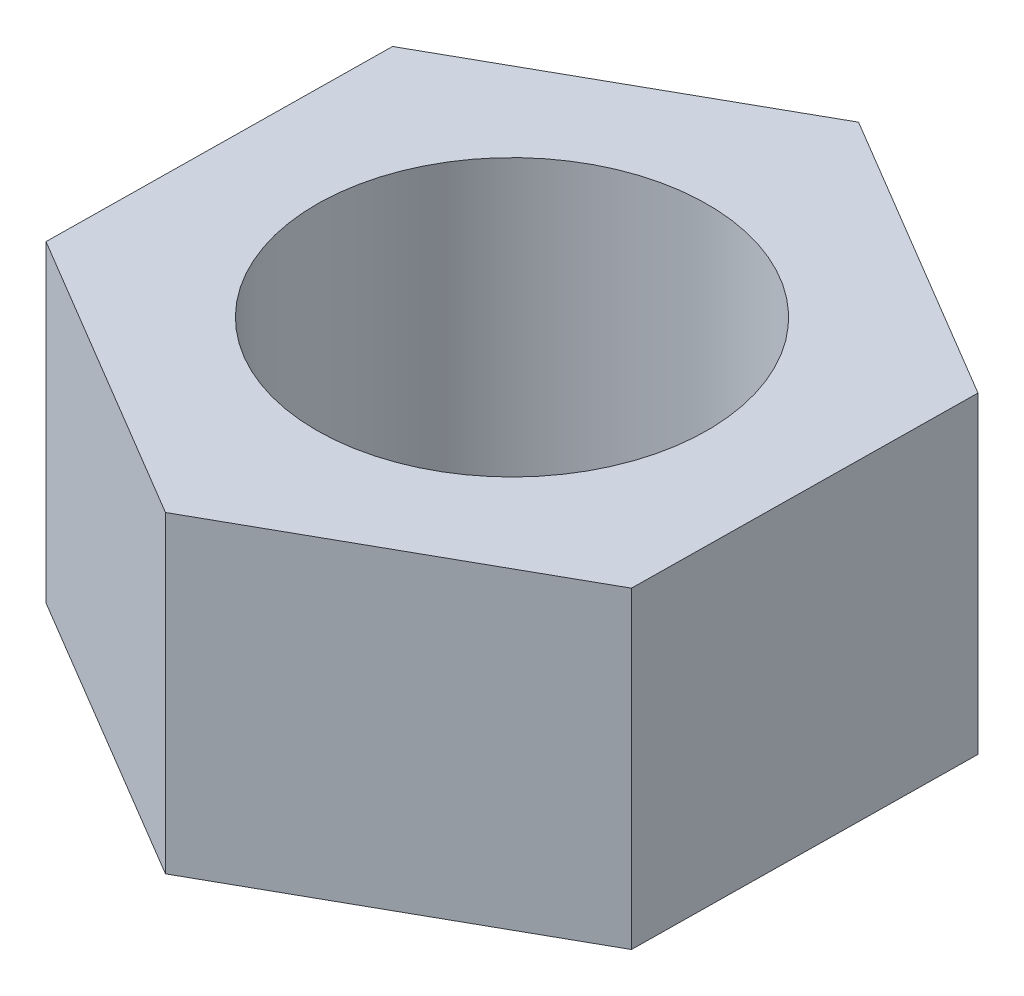
ISO-10303-21;
HEADER;
FILE_DESCRIPTION(('STEP AP214'),'2;1');
FILE_NAME('part.step','',(''),(''),'','','');
FILE_SCHEMA(('AUTOMOTIVE_DESIGN { 1 0 10303 214 1 1 1 1 }'));
ENDSEC;
DATA;
#1=APPLICATION_CONTEXT('core data for automotive mechanical design processes');
#2=APPLICATION_PROTOCOL_DEFINITION('international standard','automotive_design',2000,#1);
#3=PRODUCT_CONTEXT('',#1,'mechanical');
#4=PRODUCT('Part','Part','',(#3));
#5=PRODUCT_RELATED_PRODUCT_CATEGORY('part','',(#4));
#6=PRODUCT_DEFINITION_FORMATION('','',#4);
#7=PRODUCT_DEFINITION_CONTEXT('part definition',#1,'design');
#8=PRODUCT_DEFINITION('design','',#6,#7);
#9=PRODUCT_DEFINITION_SHAPE('','',#8);
#10=(LENGTH_UNIT() NAMED_UNIT(*) SI_UNIT(.MILLI.,.METRE.));
#11=(NAMED_UNIT(*) PLANE_ANGLE_UNIT() SI_UNIT($,.RADIAN.));
#12=(NAMED_UNIT(*) SI_UNIT($,.STERADIAN.) SOLID_ANGLE_UNIT());
#13=UNCERTAINTY_MEASURE_WITH_UNIT(LENGTH_MEASURE(1.E-05),#10,'distance_accuracy_value','');
#14=(GEOMETRIC_REPRESENTATION_CONTEXT(3) GLOBAL_UNCERTAINTY_ASSIGNED_CONTEXT((#13)) GLOBAL_UNIT_ASSIGNED_CONTEXT((#10,
#11,#12)) REPRESENTATION_CONTEXT('',''));
#15=CARTESIAN_POINT('',(0.,0.,0.));
#16=DIRECTION('',(0.,0.,1.));
#17=DIRECTION('',(1.,0.,0.));
#18=AXIS2_PLACEMENT_3D('',#15,#16,#17);
#19=CARTESIAN_POINT('',(0.,3.2,0.));
#20=DIRECTION('',(0.,1.,0.));
#21=DIRECTION('',(0.,0.,1.));
#22=AXIS2_PLACEMENT_3D('',#19,#20,#21);
#23=PLANE('',#22);
#24=DIRECTION('',(0.872192026278083,0.,-0.489163642656456));
#25=VECTOR('',#24,1.);
#26=CARTESIAN_POINT('',(-0.043637551967861,3.2,3.49972795572145));
#27=LINE('',#26,#25);
#28=CARTESIAN_POINT('',(-0.043637551967861,3.2,3.49972795572145));
#29=VERTEX_POINT('',#28);
#30=CARTESIAN_POINT('',(3.00903454000543,3.2,1.78765520642386));
#31=VERTEX_POINT('',#30);
#32=EDGE_CURVE('E152',#29,#31,#27,.T.);
#33=ORIENTED_EDGE('',*,*,#32,.T.);
#34=DIRECTION('',(0.0124678719908176,0.,-0.999922273063272));
#35=VECTOR('',#34,1.);
#36=CARTESIAN_POINT('',(3.00903454000543,3.2,1.78765520642386));
#37=LINE('',#36,#35);
#38=CARTESIAN_POINT('',(3.05267209197329,3.2,-1.71207274929759));
#39=VERTEX_POINT('',#38);
#40=EDGE_CURVE('E100',#31,#39,#37,.T.);
#41=ORIENTED_EDGE('',*,*,#40,.T.);
#42=DIRECTION('',(-0.859724154287265,0.,-0.510758630406816));
#43=VECTOR('',#42,1.);
#44=CARTESIAN_POINT('',(3.05267209197329,3.2,-1.71207274929759));
#45=LINE('',#44,#43);
#46=CARTESIAN_POINT('',(0.0436375519678614,3.2,-3.49972795572145));
#47=VERTEX_POINT('',#46);
#48=EDGE_CURVE('E113',#39,#47,#45,.T.);
#49=ORIENTED_EDGE('',*,*,#48,.T.);
#50=DIRECTION('',(-0.872192026278082,0.,0.489163642656456));
#51=VECTOR('',#50,1.);
#52=CARTESIAN_POINT('',(0.0436375519678614,3.2,-3.49972795572145));
#53=LINE('',#52,#51);
#54=CARTESIAN_POINT('',(-3.00903454000543,3.2,-1.78765520642386));
#55=VERTEX_POINT('',#54);
#56=EDGE_CURVE('E107',#47,#55,#53,.T.);
#57=ORIENTED_EDGE('',*,*,#56,.T.);
#58=DIRECTION('',(-0.0124678719908177,0.,0.999922273063272));
#59=VECTOR('',#58,1.);
#60=CARTESIAN_POINT('',(-3.00903454000543,3.2,-1.78765520642386));
#61=LINE('',#60,#59);
#62=CARTESIAN_POINT('',(-3.05267209197329,3.2,1.71207274929759));
#63=VERTEX_POINT('',#62);
#64=EDGE_CURVE('E111',#55,#63,#61,.T.);
#65=ORIENTED_EDGE('',*,*,#64,.T.);
#66=DIRECTION('',(0.859724154287265,0.,0.510758630406816));
#67=VECTOR('',#66,1.);
#68=CARTESIAN_POINT('',(-3.05267209197329,3.2,1.71207274929759));
#69=LINE('',#68,#67);
#70=EDGE_CURVE('E63',#63,#29,#69,.T.);
#71=ORIENTED_EDGE('',*,*,#70,.T.);
#72=EDGE_LOOP('',(#33,#41,#49,#57,#65,#71));
#73=FACE_BOUND('',#72,.T.);
#74=CARTESIAN_POINT('',(0.,3.2,0.));
#75=DIRECTION('',(0.,1.,0.));
#76=DIRECTION('',(0.,0.,1.));
#77=AXIS2_PLACEMENT_3D('',#74,#75,#76);
#78=CIRCLE('',#77,2.);
#79=CARTESIAN_POINT('',(0.,3.2,2.));
#80=VERTEX_POINT('',#79);
#81=EDGE_CURVE('E140',#80,#80,#78,.T.);
#82=ORIENTED_EDGE('',*,*,#81,.F.);
#83=EDGE_LOOP('',(#82));
#84=FACE_BOUND('',#83,.T.);
#85=ADVANCED_FACE('F45',(#73,#84),#23,.T.);
#86=CARTESIAN_POINT('',(0.,0.,0.));
#87=DIRECTION('',(0.,1.,0.));
#88=DIRECTION('',(0.,0.,1.));
#89=AXIS2_PLACEMENT_3D('',#86,#87,#88);
#90=PLANE('',#89);
#91=DIRECTION('',(0.872192026278083,0.,-0.489163642656456));
#92=VECTOR('',#91,1.);
#93=CARTESIAN_POINT('',(-0.043637551967861,0.,3.49972795572145));
#94=LINE('',#93,#92);
#95=CARTESIAN_POINT('',(-0.043637551967861,0.,3.49972795572145));
#96=VERTEX_POINT('',#95);
#97=CARTESIAN_POINT('',(3.00903454000543,0.,1.78765520642386));
#98=VERTEX_POINT('',#97);
#99=EDGE_CURVE('E135',#96,#98,#94,.T.);
#100=ORIENTED_EDGE('',*,*,#99,.F.);
#101=DIRECTION('',(0.859724154287265,0.,0.510758630406816));
#102=VECTOR('',#101,1.);
#103=CARTESIAN_POINT('',(-3.05267209197329,0.,1.71207274929759));
#104=LINE('',#103,#102);
#105=CARTESIAN_POINT('',(-3.05267209197329,0.,1.71207274929759));
#106=VERTEX_POINT('',#105);
#107=EDGE_CURVE('E92',#106,#96,#104,.T.);
#108=ORIENTED_EDGE('',*,*,#107,.F.);
#109=DIRECTION('',(-0.0124678719908177,0.,0.999922273063272));
#110=VECTOR('',#109,1.);
#111=CARTESIAN_POINT('',(-3.00903454000543,0.,-1.78765520642386));
#112=LINE('',#111,#110);
#113=CARTESIAN_POINT('',(-3.00903454000543,0.,-1.78765520642386));
#114=VERTEX_POINT('',#113);
#115=EDGE_CURVE('E86',#114,#106,#112,.T.);
#116=ORIENTED_EDGE('',*,*,#115,.F.);
#117=DIRECTION('',(-0.872192026278082,0.,0.489163642656456));
#118=VECTOR('',#117,1.);
#119=CARTESIAN_POINT('',(0.0436375519678614,0.,-3.49972795572145));
#120=LINE('',#119,#118);
#121=CARTESIAN_POINT('',(0.0436375519678614,0.,-3.49972795572145));
#122=VERTEX_POINT('',#121);
#123=EDGE_CURVE('E122',#122,#114,#120,.T.);
#124=ORIENTED_EDGE('',*,*,#123,.F.);
#125=DIRECTION('',(-0.859724154287265,0.,-0.510758630406816));
#126=VECTOR('',#125,1.);
#127=CARTESIAN_POINT('',(3.05267209197329,0.,-1.71207274929759));
#128=LINE('',#127,#126);
#129=CARTESIAN_POINT('',(3.05267209197329,0.,-1.71207274929759));
#130=VERTEX_POINT('',#129);
#131=EDGE_CURVE('E143',#130,#122,#128,.T.);
#132=ORIENTED_EDGE('',*,*,#131,.F.);
#133=DIRECTION('',(0.0124678719908176,0.,-0.999922273063272));
#134=VECTOR('',#133,1.);
#135=CARTESIAN_POINT('',(3.00903454000543,0.,1.78765520642386));
#136=LINE('',#135,#134);
#137=EDGE_CURVE('E139',#98,#130,#136,.T.);
#138=ORIENTED_EDGE('',*,*,#137,.F.);
#139=EDGE_LOOP('',(#100,#108,#116,#124,#132,#138));
#140=FACE_BOUND('',#139,.T.);
#141=CARTESIAN_POINT('',(0.,0.,0.));
#142=DIRECTION('',(0.,1.,0.));
#143=DIRECTION('',(0.,0.,1.));
#144=AXIS2_PLACEMENT_3D('',#141,#142,#143);
#145=CIRCLE('',#144,2.);
#146=CARTESIAN_POINT('',(0.,0.,2.));
#147=VERTEX_POINT('',#146);
#148=EDGE_CURVE('E249',#147,#147,#145,.T.);
#149=ORIENTED_EDGE('',*,*,#148,.T.);
#150=EDGE_LOOP('',(#149));
#151=FACE_BOUND('',#150,.T.);
#152=ADVANCED_FACE('F165',(#140,#151),#90,.F.);
#153=CARTESIAN_POINT('',(-0.043637551967861,3.2,3.49972795572145));
#154=DIRECTION('',(-0.489163642656456,0.,-0.872192026278083));
#155=DIRECTION('',(-0.872192026278083,0.,0.489163642656456));
#156=AXIS2_PLACEMENT_3D('',#153,#154,#155);
#157=PLANE('',#156);
#158=ORIENTED_EDGE('',*,*,#99,.T.);
#159=DIRECTION('',(0.,-1.,0.));
#160=VECTOR('',#159,1.);
#161=CARTESIAN_POINT('',(3.00903454000543,3.2,1.78765520642386));
#162=LINE('',#161,#160);
#163=EDGE_CURVE('E11',#31,#98,#162,.T.);
#164=ORIENTED_EDGE('',*,*,#163,.F.);
#165=ORIENTED_EDGE('',*,*,#32,.F.);
#166=DIRECTION('',(0.,-1.,0.));
#167=VECTOR('',#166,1.);
#168=CARTESIAN_POINT('',(-0.043637551967861,3.2,3.49972795572145));
#169=LINE('',#168,#167);
#170=EDGE_CURVE('E131',#29,#96,#169,.T.);
#171=ORIENTED_EDGE('',*,*,#170,.T.);
#172=EDGE_LOOP('',(#158,#164,#165,#171));
#173=FACE_BOUND('',#172,.T.);
#174=ADVANCED_FACE('F47',(#173),#157,.F.);
#175=CARTESIAN_POINT('',(3.00903454000543,3.2,1.78765520642386));
#176=DIRECTION('',(-0.999922273063272,0.,-0.0124678719908176));
#177=DIRECTION('',(-0.0124678719908176,0.,0.999922273063272));
#178=AXIS2_PLACEMENT_3D('',#175,#176,#177);
#179=PLANE('',#178);
#180=ORIENTED_EDGE('',*,*,#137,.T.);
#181=DIRECTION('',(0.,-1.,0.));
#182=VECTOR('',#181,1.);
#183=CARTESIAN_POINT('',(3.05267209197329,3.2,-1.71207274929759));
#184=LINE('',#183,#182);
#185=EDGE_CURVE('E55',#39,#130,#184,.T.);
#186=ORIENTED_EDGE('',*,*,#185,.F.);
#187=ORIENTED_EDGE('',*,*,#40,.F.);
#188=ORIENTED_EDGE('',*,*,#163,.T.);
#189=EDGE_LOOP('',(#180,#186,#187,#188));
#190=FACE_BOUND('',#189,.T.);
#191=ADVANCED_FACE('F190',(#190),#179,.F.);
#192=CARTESIAN_POINT('',(3.05267209197329,3.2,-1.71207274929759));
#193=DIRECTION('',(-0.510758630406816,0.,0.859724154287265));
#194=DIRECTION('',(0.859724154287265,0.,0.510758630406816));
#195=AXIS2_PLACEMENT_3D('',#192,#193,#194);
#196=PLANE('',#195);
#197=ORIENTED_EDGE('',*,*,#131,.T.);
#198=DIRECTION('',(0.,-1.,0.));
#199=VECTOR('',#198,1.);
#200=CARTESIAN_POINT('',(0.0436375519678614,3.2,-3.49972795572145));
#201=LINE('',#200,#199);
#202=EDGE_CURVE('E124',#47,#122,#201,.T.);
#203=ORIENTED_EDGE('',*,*,#202,.F.);
#204=ORIENTED_EDGE('',*,*,#48,.F.);
#205=ORIENTED_EDGE('',*,*,#185,.T.);
#206=EDGE_LOOP('',(#197,#203,#204,#205));
#207=FACE_BOUND('',#206,.T.);
#208=ADVANCED_FACE('F162',(#207),#196,.F.);
#209=CARTESIAN_POINT('',(0.0436375519678614,3.2,-3.49972795572145));
#210=DIRECTION('',(0.489163642656456,0.,0.872192026278083));
#211=DIRECTION('',(0.872192026278083,0.,-0.489163642656456));
#212=AXIS2_PLACEMENT_3D('',#209,#210,#211);
#213=PLANE('',#212);
#214=ORIENTED_EDGE('',*,*,#123,.T.);
#215=DIRECTION('',(0.,-1.,0.));
#216=VECTOR('',#215,1.);
#217=CARTESIAN_POINT('',(-3.00903454000543,3.2,-1.78765520642386));
#218=LINE('',#217,#216);
#219=EDGE_CURVE('E119',#55,#114,#218,.T.);
#220=ORIENTED_EDGE('',*,*,#219,.F.);
#221=ORIENTED_EDGE('',*,*,#56,.F.);
#222=ORIENTED_EDGE('',*,*,#202,.T.);
#223=EDGE_LOOP('',(#214,#220,#221,#222));
#224=FACE_BOUND('',#223,.T.);
#225=ADVANCED_FACE('F120',(#224),#213,.F.);
#226=CARTESIAN_POINT('',(-3.00903454000543,3.2,-1.78765520642386));
#227=DIRECTION('',(0.999922273063272,0.,0.0124678719908177));
#228=DIRECTION('',(0.0124678719908177,0.,-0.999922273063272));
#229=AXIS2_PLACEMENT_3D('',#226,#227,#228);
#230=PLANE('',#229);
#231=ORIENTED_EDGE('',*,*,#115,.T.);
#232=DIRECTION('',(0.,-1.,0.));
#233=VECTOR('',#232,1.);
#234=CARTESIAN_POINT('',(-3.05267209197329,3.2,1.71207274929759));
#235=LINE('',#234,#233);
#236=EDGE_CURVE('E125',#63,#106,#235,.T.);
#237=ORIENTED_EDGE('',*,*,#236,.F.);
#238=ORIENTED_EDGE('',*,*,#64,.F.);
#239=ORIENTED_EDGE('',*,*,#219,.T.);
#240=EDGE_LOOP('',(#231,#237,#238,#239));
#241=FACE_BOUND('',#240,.T.);
#242=ADVANCED_FACE('F127',(#241),#230,.F.);
#243=CARTESIAN_POINT('',(-3.05267209197329,3.2,1.71207274929759));
#244=DIRECTION('',(0.510758630406816,0.,-0.859724154287265));
#245=DIRECTION('',(-0.859724154287265,0.,-0.510758630406816));
#246=AXIS2_PLACEMENT_3D('',#243,#244,#245);
#247=PLANE('',#246);
#248=ORIENTED_EDGE('',*,*,#107,.T.);
#249=ORIENTED_EDGE('',*,*,#170,.F.);
#250=ORIENTED_EDGE('',*,*,#70,.F.);
#251=ORIENTED_EDGE('',*,*,#236,.T.);
#252=EDGE_LOOP('',(#248,#249,#250,#251));
#253=FACE_BOUND('',#252,.T.);
#254=ADVANCED_FACE('F170',(#253),#247,.F.);
#255=CARTESIAN_POINT('',(0.,3.2,0.));
#256=DIRECTION('',(0.,-1.,0.));
#257=DIRECTION('',(0.,0.,-1.));
#258=AXIS2_PLACEMENT_3D('',#255,#256,#257);
#259=CYLINDRICAL_SURFACE('',#258,2.);
#260=ORIENTED_EDGE('',*,*,#81,.T.);
#261=EDGE_LOOP('',(#260));
#262=FACE_BOUND('',#261,.T.);
#263=ORIENTED_EDGE('',*,*,#148,.F.);
#264=EDGE_LOOP('',(#263));
#265=FACE_BOUND('',#264,.T.);
#266=ADVANCED_FACE('F172',(#262,#265),#259,.F.);
#267=CLOSED_SHELL('',(#85,#152,#174,#191,#208,#225,#242,#254,#266));
#268=MANIFOLD_SOLID_BREP('B2',#267);
#269=ADVANCED_BREP_SHAPE_REPRESENTATION('',(#18,#268),#14);
#270=SHAPE_DEFINITION_REPRESENTATION(#9,#269);
ENDSEC;
END-ISO-10303-21;
